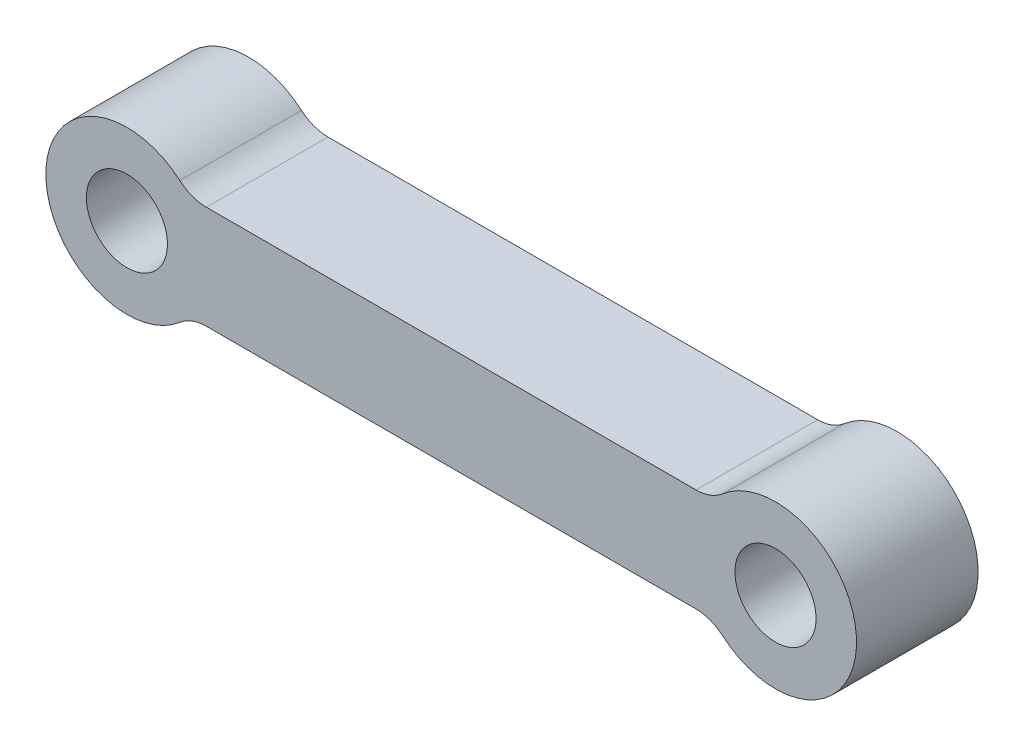
ISO-10303-21;
HEADER;
FILE_DESCRIPTION(('STEP AP214'),'2;1');
FILE_NAME('part.step','',(''),(''),'','','');
FILE_SCHEMA(('AUTOMOTIVE_DESIGN { 1 0 10303 214 1 1 1 1 }'));
ENDSEC;
DATA;
#1=APPLICATION_CONTEXT('core data for automotive mechanical design processes');
#2=APPLICATION_PROTOCOL_DEFINITION('international standard','automotive_design',2000,#1);
#3=PRODUCT_CONTEXT('',#1,'mechanical');
#4=PRODUCT('Part','Part','',(#3));
#5=PRODUCT_RELATED_PRODUCT_CATEGORY('part','',(#4));
#6=PRODUCT_DEFINITION_FORMATION('','',#4);
#7=PRODUCT_DEFINITION_CONTEXT('part definition',#1,'design');
#8=PRODUCT_DEFINITION('design','',#6,#7);
#9=PRODUCT_DEFINITION_SHAPE('','',#8);
#10=(LENGTH_UNIT() NAMED_UNIT(*) SI_UNIT(.MILLI.,.METRE.));
#11=(NAMED_UNIT(*) PLANE_ANGLE_UNIT() SI_UNIT($,.RADIAN.));
#12=(NAMED_UNIT(*) SI_UNIT($,.STERADIAN.) SOLID_ANGLE_UNIT());
#13=UNCERTAINTY_MEASURE_WITH_UNIT(LENGTH_MEASURE(1.E-05),#10,'distance_accuracy_value','');
#14=(GEOMETRIC_REPRESENTATION_CONTEXT(3) GLOBAL_UNCERTAINTY_ASSIGNED_CONTEXT((#13)) GLOBAL_UNIT_ASSIGNED_CONTEXT((#10,
#11,#12)) REPRESENTATION_CONTEXT('',''));
#15=CARTESIAN_POINT('',(0.,0.,0.));
#16=DIRECTION('',(0.,0.,1.));
#17=DIRECTION('',(1.,0.,0.));
#18=AXIS2_PLACEMENT_3D('',#15,#16,#17);
#19=CARTESIAN_POINT('',(0.,2.54336601462051,6.));
#20=DIRECTION('',(0.,1.,0.));
#21=DIRECTION('',(-1.,0.,0.));
#22=AXIS2_PLACEMENT_3D('',#19,#20,#21);
#23=PLANE('',#22);
#24=DIRECTION('',(1.,0.,0.));
#25=VECTOR('',#24,1.);
#26=CARTESIAN_POINT('',(0.,2.54336601462051,6.));
#27=LINE('',#26,#25);
#28=CARTESIAN_POINT('',(3.9189061301837,2.54336601462051,6.));
#29=VERTEX_POINT('',#28);
#30=CARTESIAN_POINT('',(28.0810938698163,2.54336601462051,6.));
#31=VERTEX_POINT('',#30);
#32=EDGE_CURVE('E167',#29,#31,#27,.T.);
#33=ORIENTED_EDGE('',*,*,#32,.T.);
#34=DIRECTION('',(0.,0.,-1.));
#35=VECTOR('',#34,1.);
#36=CARTESIAN_POINT('',(28.0810938698163,2.54336601462051,6.));
#37=LINE('',#36,#35);
#38=CARTESIAN_POINT('',(28.0810938698163,2.54336601462051,0.));
#39=VERTEX_POINT('',#38);
#40=EDGE_CURVE('E119',#31,#39,#37,.T.);
#41=ORIENTED_EDGE('',*,*,#40,.T.);
#42=DIRECTION('',(1.,0.,0.));
#43=VECTOR('',#42,1.);
#44=CARTESIAN_POINT('',(0.,2.54336601462051,0.));
#45=LINE('',#44,#43);
#46=CARTESIAN_POINT('',(3.9189061301837,2.54336601462051,0.));
#47=VERTEX_POINT('',#46);
#48=EDGE_CURVE('E103',#47,#39,#45,.T.);
#49=ORIENTED_EDGE('',*,*,#48,.F.);
#50=DIRECTION('',(0.,0.,-1.));
#51=VECTOR('',#50,1.);
#52=CARTESIAN_POINT('',(3.9189061301837,2.54336601462051,6.));
#53=LINE('',#52,#51);
#54=EDGE_CURVE('E116',#47,#29,#53,.F.);
#55=ORIENTED_EDGE('',*,*,#54,.T.);
#56=EDGE_LOOP('',(#33,#41,#49,#55));
#57=FACE_BOUND('',#56,.T.);
#58=ADVANCED_FACE('F35',(#57),#23,.T.);
#59=CARTESIAN_POINT('',(0.,0.,6.));
#60=DIRECTION('',(0.,0.,-1.));
#61=DIRECTION('',(-1.,0.,0.));
#62=AXIS2_PLACEMENT_3D('',#59,#60,#61);
#63=CYLINDRICAL_SURFACE('',#62,4.);
#64=CARTESIAN_POINT('',(0.,0.,6.));
#65=DIRECTION('',(0.,0.,1.));
#66=DIRECTION('',(1.,0.,0.));
#67=AXIS2_PLACEMENT_3D('',#64,#65,#66);
#68=CIRCLE('',#67,4.);
#69=CARTESIAN_POINT('',(2.61260408678913,3.02891067641367,6.));
#70=VERTEX_POINT('',#69);
#71=CARTESIAN_POINT('',(2.61260408678914,-3.02891067641367,6.));
#72=VERTEX_POINT('',#71);
#73=EDGE_CURVE('E165',#70,#72,#68,.T.);
#74=ORIENTED_EDGE('',*,*,#73,.F.);
#75=DIRECTION('',(0.,0.,-1.));
#76=VECTOR('',#75,1.);
#77=CARTESIAN_POINT('',(2.61260408678913,3.02891067641367,6.));
#78=LINE('',#77,#76);
#79=CARTESIAN_POINT('',(2.61260408678913,3.02891067641367,0.));
#80=VERTEX_POINT('',#79);
#81=EDGE_CURVE('E141',#70,#80,#78,.T.);
#82=ORIENTED_EDGE('',*,*,#81,.T.);
#83=CARTESIAN_POINT('',(0.,0.,0.));
#84=DIRECTION('',(0.,0.,1.));
#85=DIRECTION('',(1.,0.,0.));
#86=AXIS2_PLACEMENT_3D('',#83,#84,#85);
#87=CIRCLE('',#86,4.);
#88=CARTESIAN_POINT('',(2.61260408678914,-3.02891067641367,0.));
#89=VERTEX_POINT('',#88);
#90=EDGE_CURVE('E105',#80,#89,#87,.T.);
#91=ORIENTED_EDGE('',*,*,#90,.T.);
#92=DIRECTION('',(0.,0.,-1.));
#93=VECTOR('',#92,1.);
#94=CARTESIAN_POINT('',(2.61260408678914,-3.02891067641367,6.));
#95=LINE('',#94,#93);
#96=EDGE_CURVE('E139',#89,#72,#95,.F.);
#97=ORIENTED_EDGE('',*,*,#96,.T.);
#98=EDGE_LOOP('',(#74,#82,#91,#97));
#99=FACE_BOUND('',#98,.T.);
#100=ADVANCED_FACE('F161',(#99),#63,.T.);
#101=CARTESIAN_POINT('',(0.,-2.5433660146205,6.));
#102=DIRECTION('',(0.,1.,0.));
#103=DIRECTION('',(-1.,0.,0.));
#104=AXIS2_PLACEMENT_3D('',#101,#102,#103);
#105=PLANE('',#104);
#106=DIRECTION('',(1.,0.,0.));
#107=VECTOR('',#106,1.);
#108=CARTESIAN_POINT('',(0.,-2.5433660146205,0.));
#109=LINE('',#108,#107);
#110=CARTESIAN_POINT('',(3.9189061301837,-2.5433660146205,0.));
#111=VERTEX_POINT('',#110);
#112=CARTESIAN_POINT('',(28.0810938698163,-2.5433660146205,0.));
#113=VERTEX_POINT('',#112);
#114=EDGE_CURVE('E155',#111,#113,#109,.T.);
#115=ORIENTED_EDGE('',*,*,#114,.T.);
#116=DIRECTION('',(0.,0.,1.));
#117=VECTOR('',#116,1.);
#118=CARTESIAN_POINT('',(28.0810938698163,-2.5433660146205,6.));
#119=LINE('',#118,#117);
#120=CARTESIAN_POINT('',(28.0810938698163,-2.5433660146205,6.));
#121=VERTEX_POINT('',#120);
#122=EDGE_CURVE('E50',#113,#121,#119,.T.);
#123=ORIENTED_EDGE('',*,*,#122,.T.);
#124=DIRECTION('',(1.,0.,0.));
#125=VECTOR('',#124,1.);
#126=CARTESIAN_POINT('',(0.,-2.5433660146205,6.));
#127=LINE('',#126,#125);
#128=CARTESIAN_POINT('',(3.9189061301837,-2.5433660146205,6.));
#129=VERTEX_POINT('',#128);
#130=EDGE_CURVE('E129',#129,#121,#127,.T.);
#131=ORIENTED_EDGE('',*,*,#130,.F.);
#132=DIRECTION('',(0.,0.,1.));
#133=VECTOR('',#132,1.);
#134=CARTESIAN_POINT('',(3.9189061301837,-2.5433660146205,0.));
#135=LINE('',#134,#133);
#136=EDGE_CURVE('E143',#129,#111,#135,.F.);
#137=ORIENTED_EDGE('',*,*,#136,.T.);
#138=EDGE_LOOP('',(#115,#123,#131,#137));
#139=FACE_BOUND('',#138,.T.);
#140=ADVANCED_FACE('F163',(#139),#105,.F.);
#141=CARTESIAN_POINT('',(32.,0.,6.));
#142=DIRECTION('',(0.,0.,-1.));
#143=DIRECTION('',(-1.,0.,0.));
#144=AXIS2_PLACEMENT_3D('',#141,#142,#143);
#145=CYLINDRICAL_SURFACE('',#144,2.);
#146=CARTESIAN_POINT('',(32.,0.,6.));
#147=DIRECTION('',(0.,0.,1.));
#148=DIRECTION('',(1.,0.,0.));
#149=AXIS2_PLACEMENT_3D('',#146,#147,#148);
#150=CIRCLE('',#149,2.);
#151=CARTESIAN_POINT('',(34.,0.,6.));
#152=VERTEX_POINT('',#151);
#153=EDGE_CURVE('E181',#152,#152,#150,.T.);
#154=ORIENTED_EDGE('',*,*,#153,.T.);
#155=EDGE_LOOP('',(#154));
#156=FACE_BOUND('',#155,.T.);
#157=CARTESIAN_POINT('',(32.,0.,0.));
#158=DIRECTION('',(0.,0.,1.));
#159=DIRECTION('',(1.,0.,0.));
#160=AXIS2_PLACEMENT_3D('',#157,#158,#159);
#161=CIRCLE('',#160,2.);
#162=CARTESIAN_POINT('',(34.,0.,0.));
#163=VERTEX_POINT('',#162);
#164=EDGE_CURVE('E120',#163,#163,#161,.T.);
#165=ORIENTED_EDGE('',*,*,#164,.F.);
#166=EDGE_LOOP('',(#165));
#167=FACE_BOUND('',#166,.T.);
#168=ADVANCED_FACE('F216',(#156,#167),#145,.F.);
#169=CARTESIAN_POINT('',(0.,0.,6.));
#170=DIRECTION('',(0.,0.,-1.));
#171=DIRECTION('',(-1.,0.,0.));
#172=AXIS2_PLACEMENT_3D('',#169,#170,#171);
#173=CYLINDRICAL_SURFACE('',#172,2.);
#174=CARTESIAN_POINT('',(0.,0.,6.));
#175=DIRECTION('',(0.,0.,1.));
#176=DIRECTION('',(1.,0.,0.));
#177=AXIS2_PLACEMENT_3D('',#174,#175,#176);
#178=CIRCLE('',#177,2.);
#179=CARTESIAN_POINT('',(2.,0.,6.));
#180=VERTEX_POINT('',#179);
#181=EDGE_CURVE('E176',#180,#180,#178,.T.);
#182=ORIENTED_EDGE('',*,*,#181,.T.);
#183=EDGE_LOOP('',(#182));
#184=FACE_BOUND('',#183,.T.);
#185=CARTESIAN_POINT('',(0.,0.,0.));
#186=DIRECTION('',(0.,0.,1.));
#187=DIRECTION('',(1.,0.,0.));
#188=AXIS2_PLACEMENT_3D('',#185,#186,#187);
#189=CIRCLE('',#188,2.);
#190=CARTESIAN_POINT('',(2.,0.,0.));
#191=VERTEX_POINT('',#190);
#192=EDGE_CURVE('E171',#191,#191,#189,.T.);
#193=ORIENTED_EDGE('',*,*,#192,.F.);
#194=EDGE_LOOP('',(#193));
#195=FACE_BOUND('',#194,.T.);
#196=ADVANCED_FACE('F205',(#184,#195),#173,.F.);
#197=CARTESIAN_POINT('',(32.,0.,6.));
#198=DIRECTION('',(0.,0.,-1.));
#199=DIRECTION('',(-1.,0.,0.));
#200=AXIS2_PLACEMENT_3D('',#197,#198,#199);
#201=CYLINDRICAL_SURFACE('',#200,4.);
#202=CARTESIAN_POINT('',(32.,0.,0.));
#203=DIRECTION('',(0.,0.,1.));
#204=DIRECTION('',(1.,0.,0.));
#205=AXIS2_PLACEMENT_3D('',#202,#203,#204);
#206=CIRCLE('',#205,4.);
#207=CARTESIAN_POINT('',(29.3873959132109,-3.02891067641367,0.));
#208=VERTEX_POINT('',#207);
#209=CARTESIAN_POINT('',(29.3873959132109,3.02891067641367,0.));
#210=VERTEX_POINT('',#209);
#211=EDGE_CURVE('E132',#208,#210,#206,.T.);
#212=ORIENTED_EDGE('',*,*,#211,.T.);
#213=DIRECTION('',(0.,0.,-1.));
#214=VECTOR('',#213,1.);
#215=CARTESIAN_POINT('',(29.3873959132109,3.02891067641367,6.));
#216=LINE('',#215,#214);
#217=CARTESIAN_POINT('',(29.3873959132109,3.02891067641367,6.));
#218=VERTEX_POINT('',#217);
#219=EDGE_CURVE('E137',#210,#218,#216,.F.);
#220=ORIENTED_EDGE('',*,*,#219,.T.);
#221=CARTESIAN_POINT('',(32.,0.,6.));
#222=DIRECTION('',(0.,0.,1.));
#223=DIRECTION('',(1.,0.,0.));
#224=AXIS2_PLACEMENT_3D('',#221,#222,#223);
#225=CIRCLE('',#224,4.);
#226=CARTESIAN_POINT('',(29.3873959132109,-3.02891067641367,6.));
#227=VERTEX_POINT('',#226);
#228=EDGE_CURVE('E124',#227,#218,#225,.T.);
#229=ORIENTED_EDGE('',*,*,#228,.F.);
#230=DIRECTION('',(0.,0.,-1.));
#231=VECTOR('',#230,1.);
#232=CARTESIAN_POINT('',(29.3873959132109,-3.02891067641367,6.));
#233=LINE('',#232,#231);
#234=EDGE_CURVE('E126',#227,#208,#233,.T.);
#235=ORIENTED_EDGE('',*,*,#234,.T.);
#236=EDGE_LOOP('',(#212,#220,#229,#235));
#237=FACE_BOUND('',#236,.T.);
#238=ADVANCED_FACE('F194',(#237),#201,.T.);
#239=CARTESIAN_POINT('',(0.,0.,6.));
#240=DIRECTION('',(0.,0.,1.));
#241=DIRECTION('',(1.,0.,0.));
#242=AXIS2_PLACEMENT_3D('',#239,#240,#241);
#243=PLANE('',#242);
#244=ORIENTED_EDGE('',*,*,#181,.F.);
#245=EDGE_LOOP('',(#244));
#246=FACE_BOUND('',#245,.T.);
#247=ORIENTED_EDGE('',*,*,#153,.F.);
#248=EDGE_LOOP('',(#247));
#249=FACE_BOUND('',#248,.T.);
#250=ORIENTED_EDGE('',*,*,#32,.F.);
#251=CARTESIAN_POINT('',(3.9189061301837,4.54336601462051,6.));
#252=DIRECTION('',(0.,0.,1.));
#253=DIRECTION('',(1.,0.,0.));
#254=AXIS2_PLACEMENT_3D('',#251,#252,#253);
#255=CIRCLE('',#254,2.);
#256=EDGE_CURVE('E110',#29,#70,#255,.F.);
#257=ORIENTED_EDGE('',*,*,#256,.T.);
#258=ORIENTED_EDGE('',*,*,#73,.T.);
#259=CARTESIAN_POINT('',(3.9189061301837,-4.5433660146205,6.));
#260=DIRECTION('',(0.,0.,1.));
#261=DIRECTION('',(1.,0.,0.));
#262=AXIS2_PLACEMENT_3D('',#259,#260,#261);
#263=CIRCLE('',#262,2.);
#264=EDGE_CURVE('E11',#72,#129,#263,.F.);
#265=ORIENTED_EDGE('',*,*,#264,.T.);
#266=ORIENTED_EDGE('',*,*,#130,.T.);
#267=CARTESIAN_POINT('',(28.0810938698163,-4.5433660146205,6.));
#268=DIRECTION('',(0.,0.,1.));
#269=DIRECTION('',(1.,0.,0.));
#270=AXIS2_PLACEMENT_3D('',#267,#268,#269);
#271=CIRCLE('',#270,2.);
#272=EDGE_CURVE('E153',#121,#227,#271,.F.);
#273=ORIENTED_EDGE('',*,*,#272,.T.);
#274=ORIENTED_EDGE('',*,*,#228,.T.);
#275=CARTESIAN_POINT('',(28.0810938698163,4.54336601462051,6.));
#276=DIRECTION('',(0.,0.,1.));
#277=DIRECTION('',(1.,0.,0.));
#278=AXIS2_PLACEMENT_3D('',#275,#276,#277);
#279=CIRCLE('',#278,2.);
#280=EDGE_CURVE('E111',#218,#31,#279,.F.);
#281=ORIENTED_EDGE('',*,*,#280,.T.);
#282=EDGE_LOOP('',(#250,#257,#258,#265,#266,#273,#274,#281));
#283=FACE_BOUND('',#282,.T.);
#284=ADVANCED_FACE('F195',(#246,#249,#283),#243,.T.);
#285=CARTESIAN_POINT('',(0.,0.,0.));
#286=DIRECTION('',(0.,0.,1.));
#287=DIRECTION('',(1.,0.,0.));
#288=AXIS2_PLACEMENT_3D('',#285,#286,#287);
#289=PLANE('',#288);
#290=ORIENTED_EDGE('',*,*,#192,.T.);
#291=EDGE_LOOP('',(#290));
#292=FACE_BOUND('',#291,.T.);
#293=ORIENTED_EDGE('',*,*,#164,.T.);
#294=EDGE_LOOP('',(#293));
#295=FACE_BOUND('',#294,.T.);
#296=ORIENTED_EDGE('',*,*,#90,.F.);
#297=CARTESIAN_POINT('',(3.9189061301837,4.54336601462051,0.));
#298=DIRECTION('',(0.,0.,1.));
#299=DIRECTION('',(1.,0.,0.));
#300=AXIS2_PLACEMENT_3D('',#297,#298,#299);
#301=CIRCLE('',#300,2.);
#302=EDGE_CURVE('E100',#80,#47,#301,.T.);
#303=ORIENTED_EDGE('',*,*,#302,.T.);
#304=ORIENTED_EDGE('',*,*,#48,.T.);
#305=CARTESIAN_POINT('',(28.0810938698163,4.54336601462051,0.));
#306=DIRECTION('',(0.,0.,1.));
#307=DIRECTION('',(1.,0.,0.));
#308=AXIS2_PLACEMENT_3D('',#305,#306,#307);
#309=CIRCLE('',#308,2.);
#310=EDGE_CURVE('E147',#39,#210,#309,.T.);
#311=ORIENTED_EDGE('',*,*,#310,.T.);
#312=ORIENTED_EDGE('',*,*,#211,.F.);
#313=CARTESIAN_POINT('',(28.0810938698163,-4.5433660146205,0.));
#314=DIRECTION('',(0.,0.,1.));
#315=DIRECTION('',(1.,0.,0.));
#316=AXIS2_PLACEMENT_3D('',#313,#314,#315);
#317=CIRCLE('',#316,2.);
#318=EDGE_CURVE('E151',#208,#113,#317,.T.);
#319=ORIENTED_EDGE('',*,*,#318,.T.);
#320=ORIENTED_EDGE('',*,*,#114,.F.);
#321=CARTESIAN_POINT('',(3.9189061301837,-4.5433660146205,0.));
#322=DIRECTION('',(0.,0.,1.));
#323=DIRECTION('',(1.,0.,0.));
#324=AXIS2_PLACEMENT_3D('',#321,#322,#323);
#325=CIRCLE('',#324,2.);
#326=EDGE_CURVE('E43',#111,#89,#325,.T.);
#327=ORIENTED_EDGE('',*,*,#326,.T.);
#328=EDGE_LOOP('',(#296,#303,#304,#311,#312,#319,#320,#327));
#329=FACE_BOUND('',#328,.T.);
#330=ADVANCED_FACE('F102',(#292,#295,#329),#289,.F.);
#331=CARTESIAN_POINT('',(28.0810938698163,4.54336601462051,6.));
#332=DIRECTION('',(0.,0.,-1.));
#333=DIRECTION('',(-1.,0.,0.));
#334=AXIS2_PLACEMENT_3D('',#331,#332,#333);
#335=CYLINDRICAL_SURFACE('',#334,2.);
#336=ORIENTED_EDGE('',*,*,#280,.F.);
#337=ORIENTED_EDGE('',*,*,#219,.F.);
#338=ORIENTED_EDGE('',*,*,#310,.F.);
#339=ORIENTED_EDGE('',*,*,#40,.F.);
#340=EDGE_LOOP('',(#336,#337,#338,#339));
#341=FACE_BOUND('',#340,.T.);
#342=ADVANCED_FACE('F189',(#341),#335,.F.);
#343=CARTESIAN_POINT('',(3.9189061301837,4.54336601462051,6.));
#344=DIRECTION('',(0.,0.,-1.));
#345=DIRECTION('',(-1.,0.,0.));
#346=AXIS2_PLACEMENT_3D('',#343,#344,#345);
#347=CYLINDRICAL_SURFACE('',#346,2.);
#348=ORIENTED_EDGE('',*,*,#256,.F.);
#349=ORIENTED_EDGE('',*,*,#54,.F.);
#350=ORIENTED_EDGE('',*,*,#302,.F.);
#351=ORIENTED_EDGE('',*,*,#81,.F.);
#352=EDGE_LOOP('',(#348,#349,#350,#351));
#353=FACE_BOUND('',#352,.T.);
#354=ADVANCED_FACE('F123',(#353),#347,.F.);
#355=CARTESIAN_POINT('',(28.0810938698163,-4.5433660146205,6.));
#356=DIRECTION('',(0.,0.,-1.));
#357=DIRECTION('',(-1.,0.,0.));
#358=AXIS2_PLACEMENT_3D('',#355,#356,#357);
#359=CYLINDRICAL_SURFACE('',#358,2.);
#360=ORIENTED_EDGE('',*,*,#272,.F.);
#361=ORIENTED_EDGE('',*,*,#122,.F.);
#362=ORIENTED_EDGE('',*,*,#318,.F.);
#363=ORIENTED_EDGE('',*,*,#234,.F.);
#364=EDGE_LOOP('',(#360,#361,#362,#363));
#365=FACE_BOUND('',#364,.T.);
#366=ADVANCED_FACE('F192',(#365),#359,.F.);
#367=CARTESIAN_POINT('',(3.9189061301837,-4.5433660146205,6.));
#368=DIRECTION('',(0.,0.,-1.));
#369=DIRECTION('',(-1.,0.,0.));
#370=AXIS2_PLACEMENT_3D('',#367,#368,#369);
#371=CYLINDRICAL_SURFACE('',#370,2.);
#372=ORIENTED_EDGE('',*,*,#264,.F.);
#373=ORIENTED_EDGE('',*,*,#96,.F.);
#374=ORIENTED_EDGE('',*,*,#326,.F.);
#375=ORIENTED_EDGE('',*,*,#136,.F.);
#376=EDGE_LOOP('',(#372,#373,#374,#375));
#377=FACE_BOUND('',#376,.T.);
#378=ADVANCED_FACE('F37',(#377),#371,.F.);
#379=CLOSED_SHELL('',(#58,#100,#140,#168,#196,#238,#284,#330,#342,#354,#366,#378));
#380=MANIFOLD_SOLID_BREP('B2',#379);
#381=ADVANCED_BREP_SHAPE_REPRESENTATION('',(#18,#380),#14);
#382=SHAPE_DEFINITION_REPRESENTATION(#9,#381);
ENDSEC;
END-ISO-10303-21;
